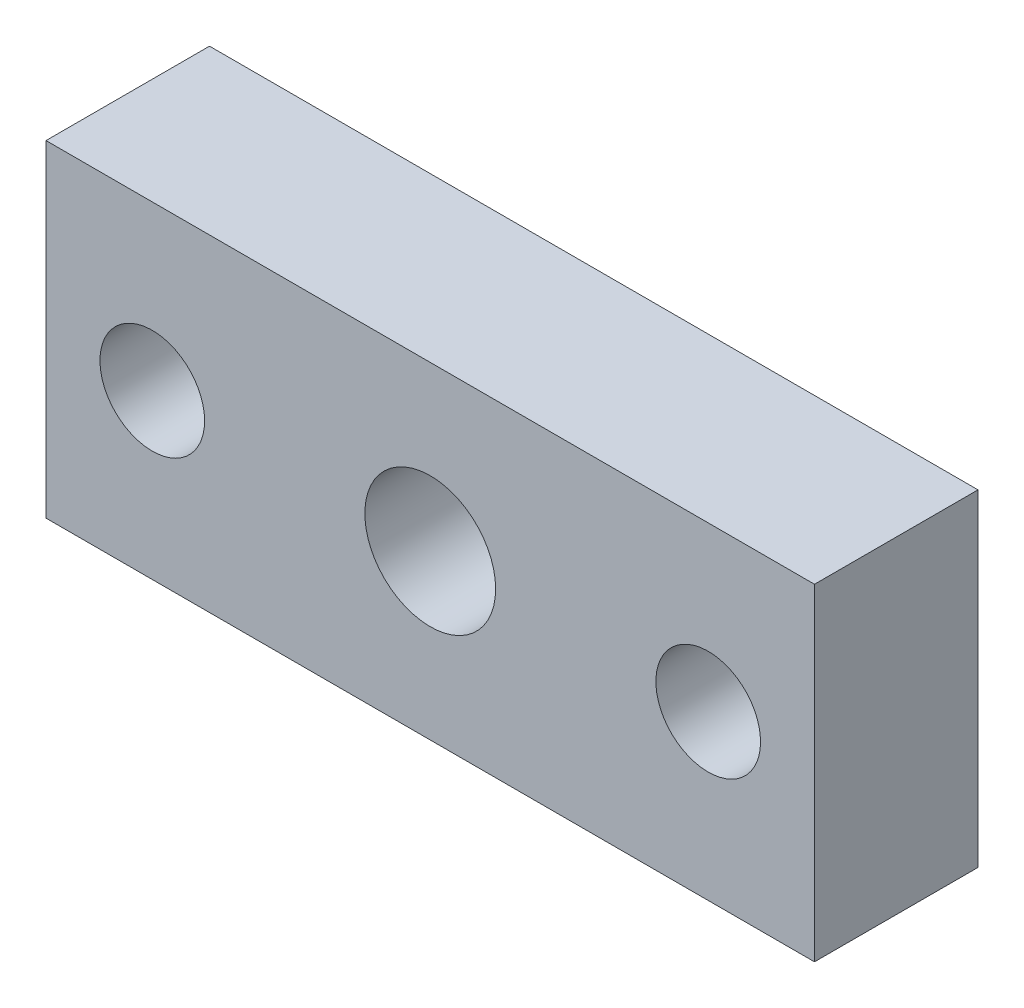
ISO-10303-21;
HEADER;
FILE_DESCRIPTION(('STEP AP214'),'2;1');
FILE_NAME('part.step','',(''),(''),'','','');
FILE_SCHEMA(('AUTOMOTIVE_DESIGN { 1 0 10303 214 1 1 1 1 }'));
ENDSEC;
DATA;
#1=APPLICATION_CONTEXT('core data for automotive mechanical design processes');
#2=APPLICATION_PROTOCOL_DEFINITION('international standard','automotive_design',2000,#1);
#3=PRODUCT_CONTEXT('',#1,'mechanical');
#4=PRODUCT('Part','Part','',(#3));
#5=PRODUCT_RELATED_PRODUCT_CATEGORY('part','',(#4));
#6=PRODUCT_DEFINITION_FORMATION('','',#4);
#7=PRODUCT_DEFINITION_CONTEXT('part definition',#1,'design');
#8=PRODUCT_DEFINITION('design','',#6,#7);
#9=PRODUCT_DEFINITION_SHAPE('','',#8);
#10=(LENGTH_UNIT() NAMED_UNIT(*) SI_UNIT(.MILLI.,.METRE.));
#11=(NAMED_UNIT(*) PLANE_ANGLE_UNIT() SI_UNIT($,.RADIAN.));
#12=(NAMED_UNIT(*) SI_UNIT($,.STERADIAN.) SOLID_ANGLE_UNIT());
#13=UNCERTAINTY_MEASURE_WITH_UNIT(LENGTH_MEASURE(1.E-05),#10,'distance_accuracy_value','');
#14=(GEOMETRIC_REPRESENTATION_CONTEXT(3) GLOBAL_UNCERTAINTY_ASSIGNED_CONTEXT((#13)) GLOBAL_UNIT_ASSIGNED_CONTEXT((#10,
#11,#12)) REPRESENTATION_CONTEXT('',''));
#15=CARTESIAN_POINT('',(0.,0.,0.));
#16=DIRECTION('',(0.,0.,1.));
#17=DIRECTION('',(1.,0.,0.));
#18=AXIS2_PLACEMENT_3D('',#15,#16,#17);
#19=CARTESIAN_POINT('',(0.,0.,5.));
#20=DIRECTION('',(0.,0.,-1.));
#21=DIRECTION('',(-1.,0.,0.));
#22=AXIS2_PLACEMENT_3D('',#19,#20,#21);
#23=PLANE('',#22);
#24=CARTESIAN_POINT('',(0.,0.,5.));
#25=DIRECTION('',(0.,0.,1.));
#26=DIRECTION('',(1.,0.,0.));
#27=AXIS2_PLACEMENT_3D('',#24,#25,#26);
#28=CIRCLE('',#27,2.);
#29=CARTESIAN_POINT('',(2.,0.,5.));
#30=VERTEX_POINT('',#29);
#31=EDGE_CURVE('E128',#30,#30,#28,.T.);
#32=ORIENTED_EDGE('',*,*,#31,.F.);
#33=EDGE_LOOP('',(#32));
#34=FACE_BOUND('',#33,.T.);
#35=DIRECTION('',(0.,1.,0.));
#36=VECTOR('',#35,1.);
#37=CARTESIAN_POINT('',(11.75,-5.,5.));
#38=LINE('',#37,#36);
#39=CARTESIAN_POINT('',(11.75,-5.,5.));
#40=VERTEX_POINT('',#39);
#41=CARTESIAN_POINT('',(11.75,5.,5.));
#42=VERTEX_POINT('',#41);
#43=EDGE_CURVE('E89',#40,#42,#38,.T.);
#44=ORIENTED_EDGE('',*,*,#43,.T.);
#45=DIRECTION('',(-1.,0.,0.));
#46=VECTOR('',#45,1.);
#47=CARTESIAN_POINT('',(-11.75,5.,5.));
#48=LINE('',#47,#46);
#49=CARTESIAN_POINT('',(-11.75,5.,5.));
#50=VERTEX_POINT('',#49);
#51=EDGE_CURVE('E84',#42,#50,#48,.T.);
#52=ORIENTED_EDGE('',*,*,#51,.T.);
#53=DIRECTION('',(0.,-1.,0.));
#54=VECTOR('',#53,1.);
#55=CARTESIAN_POINT('',(-11.75,-5.,5.));
#56=LINE('',#55,#54);
#57=CARTESIAN_POINT('',(-11.75,-5.,5.));
#58=VERTEX_POINT('',#57);
#59=EDGE_CURVE('E87',#50,#58,#56,.T.);
#60=ORIENTED_EDGE('',*,*,#59,.T.);
#61=DIRECTION('',(1.,0.,0.));
#62=VECTOR('',#61,1.);
#63=CARTESIAN_POINT('',(-11.75,-5.,5.));
#64=LINE('',#63,#62);
#65=EDGE_CURVE('E54',#58,#40,#64,.T.);
#66=ORIENTED_EDGE('',*,*,#65,.T.);
#67=EDGE_LOOP('',(#44,#52,#60,#66));
#68=FACE_BOUND('',#67,.T.);
#69=CARTESIAN_POINT('',(-8.5,0.,5.));
#70=DIRECTION('',(0.,0.,1.));
#71=DIRECTION('',(1.,0.,0.));
#72=AXIS2_PLACEMENT_3D('',#69,#70,#71);
#73=CIRCLE('',#72,1.6);
#74=CARTESIAN_POINT('',(-6.9,0.,5.));
#75=VERTEX_POINT('',#74);
#76=EDGE_CURVE('E105',#75,#75,#73,.T.);
#77=ORIENTED_EDGE('',*,*,#76,.F.);
#78=EDGE_LOOP('',(#77));
#79=FACE_BOUND('',#78,.T.);
#80=CARTESIAN_POINT('',(8.5,0.,5.));
#81=DIRECTION('',(0.,0.,1.));
#82=DIRECTION('',(1.,0.,0.));
#83=AXIS2_PLACEMENT_3D('',#80,#81,#82);
#84=CIRCLE('',#83,1.6);
#85=CARTESIAN_POINT('',(10.1,0.,5.));
#86=VERTEX_POINT('',#85);
#87=EDGE_CURVE('E120',#86,#86,#84,.T.);
#88=ORIENTED_EDGE('',*,*,#87,.F.);
#89=EDGE_LOOP('',(#88));
#90=FACE_BOUND('',#89,.T.);
#91=ADVANCED_FACE('F36',(#34,#68,#79,#90),#23,.F.);
#92=CARTESIAN_POINT('',(0.,0.,0.));
#93=DIRECTION('',(0.,0.,-1.));
#94=DIRECTION('',(-1.,0.,0.));
#95=AXIS2_PLACEMENT_3D('',#92,#93,#94);
#96=PLANE('',#95);
#97=CARTESIAN_POINT('',(0.,0.,0.));
#98=DIRECTION('',(0.,0.,-1.));
#99=DIRECTION('',(-1.,0.,0.));
#100=AXIS2_PLACEMENT_3D('',#97,#98,#99);
#101=CIRCLE('',#100,2.);
#102=CARTESIAN_POINT('',(-2.,0.,0.));
#103=VERTEX_POINT('',#102);
#104=EDGE_CURVE('E40',#103,#103,#101,.T.);
#105=ORIENTED_EDGE('',*,*,#104,.F.);
#106=EDGE_LOOP('',(#105));
#107=FACE_BOUND('',#106,.T.);
#108=CARTESIAN_POINT('',(-8.5,0.,0.));
#109=DIRECTION('',(0.,0.,1.));
#110=DIRECTION('',(1.,0.,0.));
#111=AXIS2_PLACEMENT_3D('',#108,#109,#110);
#112=CIRCLE('',#111,1.6);
#113=CARTESIAN_POINT('',(-6.9,0.,0.));
#114=VERTEX_POINT('',#113);
#115=EDGE_CURVE('E117',#114,#114,#112,.T.);
#116=ORIENTED_EDGE('',*,*,#115,.T.);
#117=EDGE_LOOP('',(#116));
#118=FACE_BOUND('',#117,.T.);
#119=DIRECTION('',(0.,1.,0.));
#120=VECTOR('',#119,1.);
#121=CARTESIAN_POINT('',(11.75,-5.,0.));
#122=LINE('',#121,#120);
#123=CARTESIAN_POINT('',(11.75,-5.,0.));
#124=VERTEX_POINT('',#123);
#125=CARTESIAN_POINT('',(11.75,5.,0.));
#126=VERTEX_POINT('',#125);
#127=EDGE_CURVE('E102',#124,#126,#122,.T.);
#128=ORIENTED_EDGE('',*,*,#127,.F.);
#129=DIRECTION('',(1.,0.,0.));
#130=VECTOR('',#129,1.);
#131=CARTESIAN_POINT('',(-11.75,-5.,0.));
#132=LINE('',#131,#130);
#133=CARTESIAN_POINT('',(-11.75,-5.,0.));
#134=VERTEX_POINT('',#133);
#135=EDGE_CURVE('E77',#134,#124,#132,.T.);
#136=ORIENTED_EDGE('',*,*,#135,.F.);
#137=DIRECTION('',(0.,-1.,0.));
#138=VECTOR('',#137,1.);
#139=CARTESIAN_POINT('',(-11.75,-5.,0.));
#140=LINE('',#139,#138);
#141=CARTESIAN_POINT('',(-11.75,5.,0.));
#142=VERTEX_POINT('',#141);
#143=EDGE_CURVE('E71',#142,#134,#140,.T.);
#144=ORIENTED_EDGE('',*,*,#143,.F.);
#145=DIRECTION('',(-1.,0.,0.));
#146=VECTOR('',#145,1.);
#147=CARTESIAN_POINT('',(-11.75,5.,0.));
#148=LINE('',#147,#146);
#149=EDGE_CURVE('E93',#126,#142,#148,.T.);
#150=ORIENTED_EDGE('',*,*,#149,.F.);
#151=EDGE_LOOP('',(#128,#136,#144,#150));
#152=FACE_BOUND('',#151,.T.);
#153=CARTESIAN_POINT('',(8.5,0.,0.));
#154=DIRECTION('',(0.,0.,1.));
#155=DIRECTION('',(1.,0.,0.));
#156=AXIS2_PLACEMENT_3D('',#153,#154,#155);
#157=CIRCLE('',#156,1.6);
#158=CARTESIAN_POINT('',(10.1,0.,0.));
#159=VERTEX_POINT('',#158);
#160=EDGE_CURVE('E123',#159,#159,#157,.T.);
#161=ORIENTED_EDGE('',*,*,#160,.T.);
#162=EDGE_LOOP('',(#161));
#163=FACE_BOUND('',#162,.T.);
#164=ADVANCED_FACE('F113',(#107,#118,#152,#163),#96,.T.);
#165=CARTESIAN_POINT('',(11.75,-5.,5.));
#166=DIRECTION('',(-1.,0.,0.));
#167=DIRECTION('',(0.,0.,1.));
#168=AXIS2_PLACEMENT_3D('',#165,#166,#167);
#169=PLANE('',#168);
#170=ORIENTED_EDGE('',*,*,#127,.T.);
#171=DIRECTION('',(0.,0.,-1.));
#172=VECTOR('',#171,1.);
#173=CARTESIAN_POINT('',(11.75,5.,5.));
#174=LINE('',#173,#172);
#175=EDGE_CURVE('E11',#42,#126,#174,.T.);
#176=ORIENTED_EDGE('',*,*,#175,.F.);
#177=ORIENTED_EDGE('',*,*,#43,.F.);
#178=DIRECTION('',(0.,0.,-1.));
#179=VECTOR('',#178,1.);
#180=CARTESIAN_POINT('',(11.75,-5.,5.));
#181=LINE('',#180,#179);
#182=EDGE_CURVE('E98',#40,#124,#181,.T.);
#183=ORIENTED_EDGE('',*,*,#182,.T.);
#184=EDGE_LOOP('',(#170,#176,#177,#183));
#185=FACE_BOUND('',#184,.T.);
#186=ADVANCED_FACE('F38',(#185),#169,.F.);
#187=CARTESIAN_POINT('',(-11.75,5.,5.));
#188=DIRECTION('',(0.,-1.,0.));
#189=DIRECTION('',(0.,0.,-1.));
#190=AXIS2_PLACEMENT_3D('',#187,#188,#189);
#191=PLANE('',#190);
#192=ORIENTED_EDGE('',*,*,#149,.T.);
#193=DIRECTION('',(0.,0.,-1.));
#194=VECTOR('',#193,1.);
#195=CARTESIAN_POINT('',(-11.75,5.,5.));
#196=LINE('',#195,#194);
#197=EDGE_CURVE('E46',#50,#142,#196,.T.);
#198=ORIENTED_EDGE('',*,*,#197,.F.);
#199=ORIENTED_EDGE('',*,*,#51,.F.);
#200=ORIENTED_EDGE('',*,*,#175,.T.);
#201=EDGE_LOOP('',(#192,#198,#199,#200));
#202=FACE_BOUND('',#201,.T.);
#203=ADVANCED_FACE('F92',(#202),#191,.F.);
#204=CARTESIAN_POINT('',(-11.75,-5.,5.));
#205=DIRECTION('',(1.,0.,0.));
#206=DIRECTION('',(0.,0.,-1.));
#207=AXIS2_PLACEMENT_3D('',#204,#205,#206);
#208=PLANE('',#207);
#209=ORIENTED_EDGE('',*,*,#143,.T.);
#210=DIRECTION('',(0.,0.,-1.));
#211=VECTOR('',#210,1.);
#212=CARTESIAN_POINT('',(-11.75,-5.,5.));
#213=LINE('',#212,#211);
#214=EDGE_CURVE('E94',#58,#134,#213,.T.);
#215=ORIENTED_EDGE('',*,*,#214,.F.);
#216=ORIENTED_EDGE('',*,*,#59,.F.);
#217=ORIENTED_EDGE('',*,*,#197,.T.);
#218=EDGE_LOOP('',(#209,#215,#216,#217));
#219=FACE_BOUND('',#218,.T.);
#220=ADVANCED_FACE('F96',(#219),#208,.F.);
#221=CARTESIAN_POINT('',(-11.75,-5.,5.));
#222=DIRECTION('',(0.,1.,0.));
#223=DIRECTION('',(0.,0.,1.));
#224=AXIS2_PLACEMENT_3D('',#221,#222,#223);
#225=PLANE('',#224);
#226=ORIENTED_EDGE('',*,*,#135,.T.);
#227=ORIENTED_EDGE('',*,*,#182,.F.);
#228=ORIENTED_EDGE('',*,*,#65,.F.);
#229=ORIENTED_EDGE('',*,*,#214,.T.);
#230=EDGE_LOOP('',(#226,#227,#228,#229));
#231=FACE_BOUND('',#230,.T.);
#232=ADVANCED_FACE('F110',(#231),#225,.F.);
#233=CARTESIAN_POINT('',(-8.5,0.,5.));
#234=DIRECTION('',(0.,0.,-1.));
#235=DIRECTION('',(-1.,0.,0.));
#236=AXIS2_PLACEMENT_3D('',#233,#234,#235);
#237=CYLINDRICAL_SURFACE('',#236,1.6);
#238=ORIENTED_EDGE('',*,*,#76,.T.);
#239=EDGE_LOOP('',(#238));
#240=FACE_BOUND('',#239,.T.);
#241=ORIENTED_EDGE('',*,*,#115,.F.);
#242=EDGE_LOOP('',(#241));
#243=FACE_BOUND('',#242,.T.);
#244=ADVANCED_FACE('F142',(#240,#243),#237,.F.);
#245=CARTESIAN_POINT('',(8.5,0.,5.));
#246=DIRECTION('',(0.,0.,-1.));
#247=DIRECTION('',(-1.,0.,0.));
#248=AXIS2_PLACEMENT_3D('',#245,#246,#247);
#249=CYLINDRICAL_SURFACE('',#248,1.6);
#250=ORIENTED_EDGE('',*,*,#87,.T.);
#251=EDGE_LOOP('',(#250));
#252=FACE_BOUND('',#251,.T.);
#253=ORIENTED_EDGE('',*,*,#160,.F.);
#254=EDGE_LOOP('',(#253));
#255=FACE_BOUND('',#254,.T.);
#256=ADVANCED_FACE('F144',(#252,#255),#249,.F.);
#257=CARTESIAN_POINT('',(0.,0.,-5.));
#258=DIRECTION('',(0.,0.,1.));
#259=DIRECTION('',(1.,0.,0.));
#260=AXIS2_PLACEMENT_3D('',#257,#258,#259);
#261=CYLINDRICAL_SURFACE('',#260,2.);
#262=ORIENTED_EDGE('',*,*,#104,.T.);
#263=EDGE_LOOP('',(#262));
#264=FACE_BOUND('',#263,.T.);
#265=ORIENTED_EDGE('',*,*,#31,.T.);
#266=EDGE_LOOP('',(#265));
#267=FACE_BOUND('',#266,.T.);
#268=ADVANCED_FACE('F135',(#264,#267),#261,.F.);
#269=CLOSED_SHELL('',(#91,#164,#186,#203,#220,#232,#244,#256,#268));
#270=MANIFOLD_SOLID_BREP('B2',#269);
#271=ADVANCED_BREP_SHAPE_REPRESENTATION('',(#18,#270),#14);
#272=SHAPE_DEFINITION_REPRESENTATION(#9,#271);
ENDSEC;
END-ISO-10303-21;
